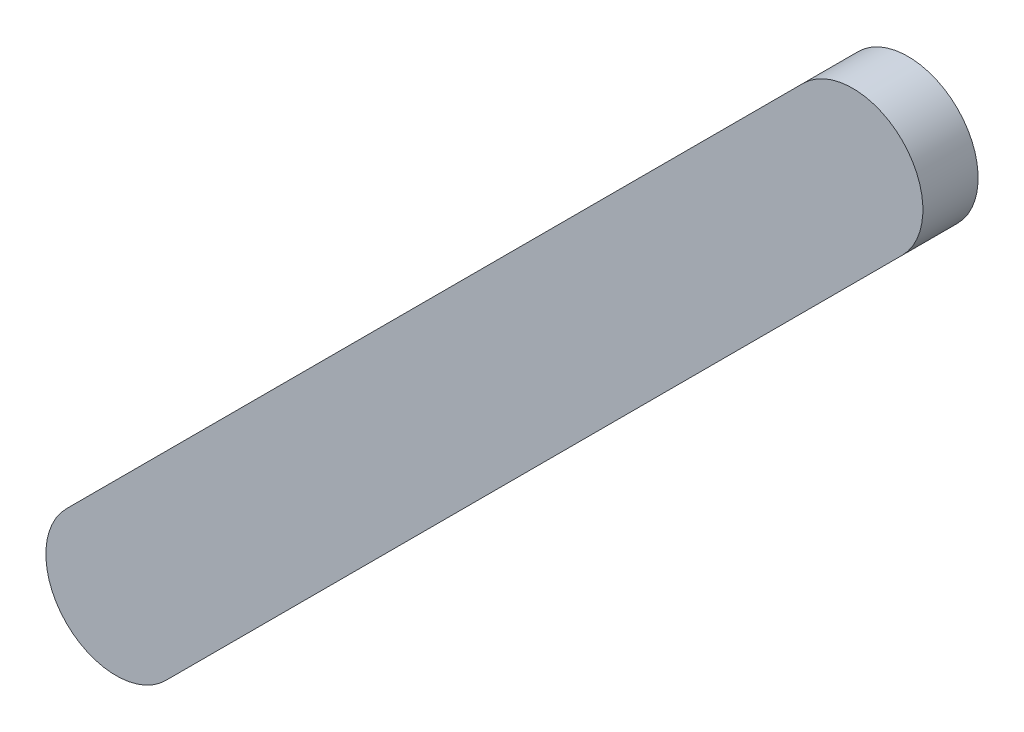
ISO-10303-21;
HEADER;
FILE_DESCRIPTION(('STEP AP214'),'2;1');
FILE_NAME('part.step','',(''),(''),'','','');
FILE_SCHEMA(('AUTOMOTIVE_DESIGN { 1 0 10303 214 1 1 1 1 }'));
ENDSEC;
DATA;
#1=APPLICATION_CONTEXT('core data for automotive mechanical design processes');
#2=APPLICATION_PROTOCOL_DEFINITION('international standard','automotive_design',2000,#1);
#3=PRODUCT_CONTEXT('',#1,'mechanical');
#4=PRODUCT('Part','Part','',(#3));
#5=PRODUCT_RELATED_PRODUCT_CATEGORY('part','',(#4));
#6=PRODUCT_DEFINITION_FORMATION('','',#4);
#7=PRODUCT_DEFINITION_CONTEXT('part definition',#1,'design');
#8=PRODUCT_DEFINITION('design','',#6,#7);
#9=PRODUCT_DEFINITION_SHAPE('','',#8);
#10=(LENGTH_UNIT() NAMED_UNIT(*) SI_UNIT(.MILLI.,.METRE.));
#11=(NAMED_UNIT(*) PLANE_ANGLE_UNIT() SI_UNIT($,.RADIAN.));
#12=(NAMED_UNIT(*) SI_UNIT($,.STERADIAN.) SOLID_ANGLE_UNIT());
#13=UNCERTAINTY_MEASURE_WITH_UNIT(LENGTH_MEASURE(1.E-05),#10,'distance_accuracy_value','');
#14=(GEOMETRIC_REPRESENTATION_CONTEXT(3) GLOBAL_UNCERTAINTY_ASSIGNED_CONTEXT((#13)) GLOBAL_UNIT_ASSIGNED_CONTEXT((#10,
#11,#12)) REPRESENTATION_CONTEXT('',''));
#15=CARTESIAN_POINT('',(0.,0.,0.));
#16=DIRECTION('',(0.,0.,1.));
#17=DIRECTION('',(1.,0.,0.));
#18=AXIS2_PLACEMENT_3D('',#15,#16,#17);
#19=CARTESIAN_POINT('',(136.57760594,119.32739406,0.));
#20=DIRECTION('',(-0.707106781186548,0.707106781186548,0.));
#21=DIRECTION('',(0.707106781186548,0.707106781186548,0.));
#22=AXIS2_PLACEMENT_3D('',#19,#20,#21);
#23=PLANE('',#22);
#24=DIRECTION('',(0.707106781186548,0.707106781186548,0.));
#25=VECTOR('',#24,1.);
#26=CARTESIAN_POINT('',(136.57760594,119.32739406,0.1999996));
#27=LINE('',#26,#25);
#28=CARTESIAN_POINT('',(136.57760594,119.32739406,0.1999996));
#29=VERTEX_POINT('',#28);
#30=CARTESIAN_POINT('',(139.24460594,121.99439406,0.1999996));
#31=VERTEX_POINT('',#30);
#32=EDGE_CURVE('E11',#29,#31,#27,.T.);
#33=ORIENTED_EDGE('',*,*,#32,.F.);
#34=DIRECTION('',(0.,0.,1.));
#35=VECTOR('',#34,1.);
#36=CARTESIAN_POINT('',(136.57760594,119.32739406,0.));
#37=LINE('',#36,#35);
#38=CARTESIAN_POINT('',(136.57760594,119.32739406,0.));
#39=VERTEX_POINT('',#38);
#40=EDGE_CURVE('E24',#39,#29,#37,.T.);
#41=ORIENTED_EDGE('',*,*,#40,.F.);
#42=DIRECTION('',(0.707106781186548,0.707106781186548,0.));
#43=VECTOR('',#42,1.);
#44=CARTESIAN_POINT('',(136.57760594,119.32739406,0.));
#45=LINE('',#44,#43);
#46=CARTESIAN_POINT('',(139.24460594,121.99439406,0.));
#47=VERTEX_POINT('',#46);
#48=EDGE_CURVE('E75',#39,#47,#45,.T.);
#49=ORIENTED_EDGE('',*,*,#48,.T.);
#50=DIRECTION('',(0.,0.,1.));
#51=VECTOR('',#50,1.);
#52=CARTESIAN_POINT('',(139.24460594,121.99439406,0.));
#53=LINE('',#52,#51);
#54=EDGE_CURVE('E37',#47,#31,#53,.T.);
#55=ORIENTED_EDGE('',*,*,#54,.T.);
#56=EDGE_LOOP('',(#33,#41,#49,#55));
#57=FACE_BOUND('',#56,.T.);
#58=ADVANCED_FACE('F17',(#57),#23,.F.);
#59=CARTESIAN_POINT('',(139.065,122.174,0.));
#60=DIRECTION('',(0.,0.,-1.));
#61=DIRECTION('',(0.70710678118652,-0.707106781186576,0.));
#62=AXIS2_PLACEMENT_3D('',#59,#60,#61);
#63=CYLINDRICAL_SURFACE('',#62,0.254001156230768);
#64=CARTESIAN_POINT('',(139.065,122.174,0.1999996));
#65=DIRECTION('',(0.,0.,1.));
#66=DIRECTION('',(0.70710678118652,-0.707106781186576,0.));
#67=AXIS2_PLACEMENT_3D('',#64,#65,#66);
#68=CIRCLE('',#67,0.254001156230768);
#69=CARTESIAN_POINT('',(138.88539406,122.35360594,0.1999996));
#70=VERTEX_POINT('',#69);
#71=EDGE_CURVE('E83',#31,#70,#68,.T.);
#72=ORIENTED_EDGE('',*,*,#71,.F.);
#73=ORIENTED_EDGE('',*,*,#54,.F.);
#74=CARTESIAN_POINT('',(139.065,122.174,0.));
#75=DIRECTION('',(0.,0.,1.));
#76=DIRECTION('',(0.70710678118652,-0.707106781186576,0.));
#77=AXIS2_PLACEMENT_3D('',#74,#75,#76);
#78=CIRCLE('',#77,0.254001156230768);
#79=CARTESIAN_POINT('',(138.88539406,122.35360594,0.));
#80=VERTEX_POINT('',#79);
#81=EDGE_CURVE('E81',#47,#80,#78,.T.);
#82=ORIENTED_EDGE('',*,*,#81,.T.);
#83=DIRECTION('',(0.,0.,1.));
#84=VECTOR('',#83,1.);
#85=CARTESIAN_POINT('',(138.88539406,122.35360594,0.));
#86=LINE('',#85,#84);
#87=EDGE_CURVE('E67',#80,#70,#86,.T.);
#88=ORIENTED_EDGE('',*,*,#87,.T.);
#89=EDGE_LOOP('',(#72,#73,#82,#88));
#90=FACE_BOUND('',#89,.T.);
#91=ADVANCED_FACE('F89',(#90),#63,.T.);
#92=CARTESIAN_POINT('',(138.88539406,122.35360594,0.));
#93=DIRECTION('',(0.707106781186548,-0.707106781186548,0.));
#94=DIRECTION('',(-0.707106781186548,-0.707106781186548,0.));
#95=AXIS2_PLACEMENT_3D('',#92,#93,#94);
#96=PLANE('',#95);
#97=DIRECTION('',(-0.707106781186548,-0.707106781186548,0.));
#98=VECTOR('',#97,1.);
#99=CARTESIAN_POINT('',(138.88539406,122.35360594,0.1999996));
#100=LINE('',#99,#98);
#101=CARTESIAN_POINT('',(136.21839406,119.68660594,0.1999996));
#102=VERTEX_POINT('',#101);
#103=EDGE_CURVE('E71',#70,#102,#100,.T.);
#104=ORIENTED_EDGE('',*,*,#103,.F.);
#105=ORIENTED_EDGE('',*,*,#87,.F.);
#106=DIRECTION('',(-0.707106781186548,-0.707106781186548,0.));
#107=VECTOR('',#106,1.);
#108=CARTESIAN_POINT('',(138.88539406,122.35360594,0.));
#109=LINE('',#108,#107);
#110=CARTESIAN_POINT('',(136.21839406,119.68660594,0.));
#111=VERTEX_POINT('',#110);
#112=EDGE_CURVE('E63',#80,#111,#109,.T.);
#113=ORIENTED_EDGE('',*,*,#112,.T.);
#114=DIRECTION('',(0.,0.,1.));
#115=VECTOR('',#114,1.);
#116=CARTESIAN_POINT('',(136.21839406,119.68660594,0.));
#117=LINE('',#116,#115);
#118=EDGE_CURVE('E53',#111,#102,#117,.T.);
#119=ORIENTED_EDGE('',*,*,#118,.T.);
#120=EDGE_LOOP('',(#104,#105,#113,#119));
#121=FACE_BOUND('',#120,.T.);
#122=ADVANCED_FACE('F66',(#121),#96,.F.);
#123=CARTESIAN_POINT('',(136.398,119.507,0.));
#124=DIRECTION('',(0.,0.,-1.));
#125=DIRECTION('',(-0.70710678118652,0.707106781186576,0.));
#126=AXIS2_PLACEMENT_3D('',#123,#124,#125);
#127=CYLINDRICAL_SURFACE('',#126,0.254001156230768);
#128=CARTESIAN_POINT('',(136.398,119.507,0.1999996));
#129=DIRECTION('',(0.,0.,1.));
#130=DIRECTION('',(-0.70710678118652,0.707106781186576,0.));
#131=AXIS2_PLACEMENT_3D('',#128,#129,#130);
#132=CIRCLE('',#131,0.254001156230768);
#133=EDGE_CURVE('E59',#102,#29,#132,.T.);
#134=ORIENTED_EDGE('',*,*,#133,.F.);
#135=ORIENTED_EDGE('',*,*,#118,.F.);
#136=CARTESIAN_POINT('',(136.398,119.507,0.));
#137=DIRECTION('',(0.,0.,1.));
#138=DIRECTION('',(-0.70710678118652,0.707106781186576,0.));
#139=AXIS2_PLACEMENT_3D('',#136,#137,#138);
#140=CIRCLE('',#139,0.254001156230768);
#141=EDGE_CURVE('E57',#111,#39,#140,.T.);
#142=ORIENTED_EDGE('',*,*,#141,.T.);
#143=ORIENTED_EDGE('',*,*,#40,.T.);
#144=EDGE_LOOP('',(#134,#135,#142,#143));
#145=FACE_BOUND('',#144,.T.);
#146=ADVANCED_FACE('F55',(#145),#127,.T.);
#147=CARTESIAN_POINT('',(136.57760594,119.32739406,0.));
#148=DIRECTION('',(0.,0.,-1.));
#149=DIRECTION('',(-1.,0.,0.));
#150=AXIS2_PLACEMENT_3D('',#147,#148,#149);
#151=PLANE('',#150);
#152=ORIENTED_EDGE('',*,*,#141,.F.);
#153=ORIENTED_EDGE('',*,*,#112,.F.);
#154=ORIENTED_EDGE('',*,*,#81,.F.);
#155=ORIENTED_EDGE('',*,*,#48,.F.);
#156=EDGE_LOOP('',(#152,#153,#154,#155));
#157=FACE_BOUND('',#156,.T.);
#158=ADVANCED_FACE('F74',(#157),#151,.T.);
#159=CARTESIAN_POINT('',(136.57760594,119.32739406,0.1999996));
#160=DIRECTION('',(0.,0.,-1.));
#161=DIRECTION('',(-1.,0.,0.));
#162=AXIS2_PLACEMENT_3D('',#159,#160,#161);
#163=PLANE('',#162);
#164=ORIENTED_EDGE('',*,*,#32,.T.);
#165=ORIENTED_EDGE('',*,*,#71,.T.);
#166=ORIENTED_EDGE('',*,*,#103,.T.);
#167=ORIENTED_EDGE('',*,*,#133,.T.);
#168=EDGE_LOOP('',(#164,#165,#166,#167));
#169=FACE_BOUND('',#168,.T.);
#170=ADVANCED_FACE('F91',(#169),#163,.F.);
#171=CLOSED_SHELL('',(#58,#91,#122,#146,#158,#170));
#172=MANIFOLD_SOLID_BREP('B1',#171);
#173=ADVANCED_BREP_SHAPE_REPRESENTATION('',(#18,#172),#14);
#174=SHAPE_DEFINITION_REPRESENTATION(#9,#173);
ENDSEC;
END-ISO-10303-21;
